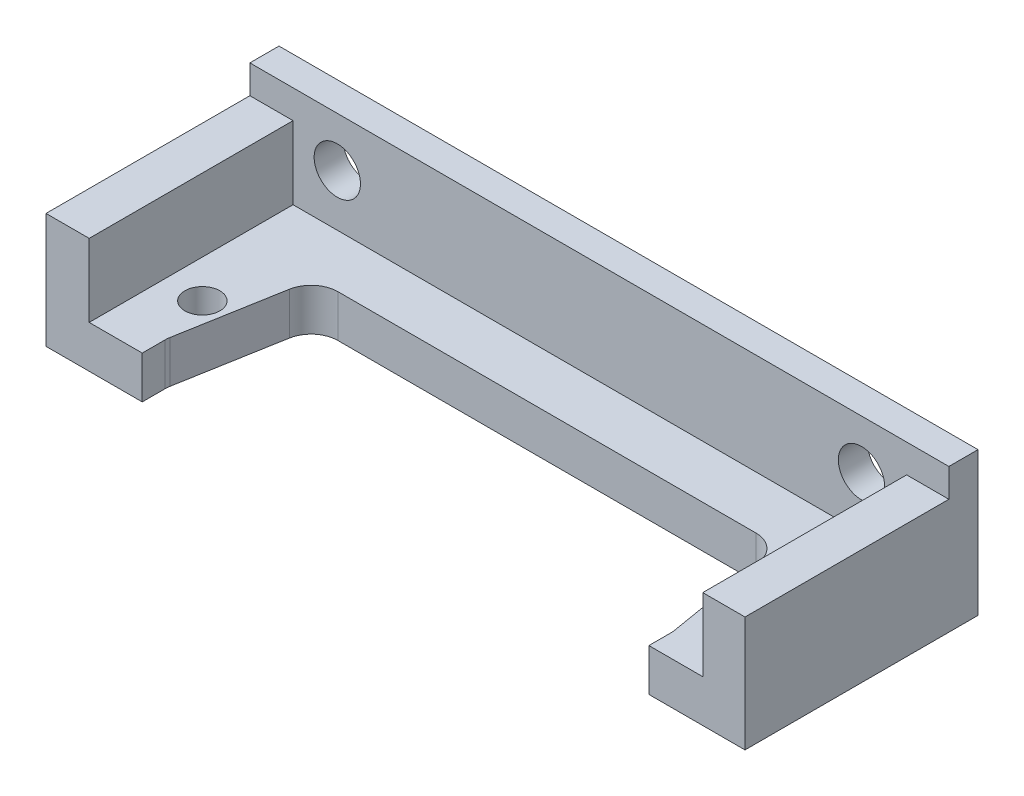
ISO-10303-21;
HEADER;
FILE_DESCRIPTION(('STEP AP214'),'2;1');
FILE_NAME('part.step','',(''),(''),'','','');
FILE_SCHEMA(('AUTOMOTIVE_DESIGN { 1 0 10303 214 1 1 1 1 }'));
ENDSEC;
DATA;
#1=APPLICATION_CONTEXT('core data for automotive mechanical design processes');
#2=APPLICATION_PROTOCOL_DEFINITION('international standard','automotive_design',2000,#1);
#3=PRODUCT_CONTEXT('',#1,'mechanical');
#4=PRODUCT('Part','Part','',(#3));
#5=PRODUCT_RELATED_PRODUCT_CATEGORY('part','',(#4));
#6=PRODUCT_DEFINITION_FORMATION('','',#4);
#7=PRODUCT_DEFINITION_CONTEXT('part definition',#1,'design');
#8=PRODUCT_DEFINITION('design','',#6,#7);
#9=PRODUCT_DEFINITION_SHAPE('','',#8);
#10=(LENGTH_UNIT() NAMED_UNIT(*) SI_UNIT(.MILLI.,.METRE.));
#11=(NAMED_UNIT(*) PLANE_ANGLE_UNIT() SI_UNIT($,.RADIAN.));
#12=(NAMED_UNIT(*) SI_UNIT($,.STERADIAN.) SOLID_ANGLE_UNIT());
#13=UNCERTAINTY_MEASURE_WITH_UNIT(LENGTH_MEASURE(1.E-05),#10,'distance_accuracy_value','');
#14=(GEOMETRIC_REPRESENTATION_CONTEXT(3) GLOBAL_UNCERTAINTY_ASSIGNED_CONTEXT((#13)) GLOBAL_UNIT_ASSIGNED_CONTEXT((#10,
#11,#12)) REPRESENTATION_CONTEXT('',''));
#15=CARTESIAN_POINT('',(0.,0.,0.));
#16=DIRECTION('',(0.,0.,1.));
#17=DIRECTION('',(1.,0.,0.));
#18=AXIS2_PLACEMENT_3D('',#15,#16,#17);
#19=CARTESIAN_POINT('',(0.,0.,20.32));
#20=DIRECTION('',(0.,0.,1.));
#21=DIRECTION('',(1.,0.,0.));
#22=AXIS2_PLACEMENT_3D('',#19,#20,#21);
#23=PLANE('',#22);
#24=DIRECTION('',(0.,1.,0.));
#25=VECTOR('',#24,1.);
#26=CARTESIAN_POINT('',(-95.7952722526986,206.215238753455,20.32));
#27=LINE('',#26,#25);
#28=CARTESIAN_POINT('',(-95.7952722526986,203.675238753455,20.32));
#29=VERTEX_POINT('',#28);
#30=CARTESIAN_POINT('',(-95.7952722526986,207.367384583948,20.32));
#31=VERTEX_POINT('',#30);
#32=EDGE_CURVE('E276',#29,#31,#27,.T.);
#33=ORIENTED_EDGE('',*,*,#32,.T.);
#34=DIRECTION('',(1.,0.,0.));
#35=VECTOR('',#34,1.);
#36=CARTESIAN_POINT('',(0.,207.367384583948,20.32));
#37=LINE('',#36,#35);
#38=CARTESIAN_POINT('',(-100.422294858781,207.367384583948,20.32));
#39=VERTEX_POINT('',#38);
#40=EDGE_CURVE('E319',#39,#31,#37,.T.);
#41=ORIENTED_EDGE('',*,*,#40,.F.);
#42=DIRECTION('',(0.,-1.,0.));
#43=VECTOR('',#42,1.);
#44=CARTESIAN_POINT('',(-100.422294858781,213.717384583948,20.32));
#45=LINE('',#44,#43);
#46=CARTESIAN_POINT('',(-100.422294858781,213.717384583948,20.32));
#47=VERTEX_POINT('',#46);
#48=EDGE_CURVE('E315',#47,#39,#45,.T.);
#49=ORIENTED_EDGE('',*,*,#48,.F.);
#50=DIRECTION('',(1.,0.,0.));
#51=VECTOR('',#50,1.);
#52=CARTESIAN_POINT('',(0.,213.717384583948,20.32));
#53=LINE('',#52,#51);
#54=CARTESIAN_POINT('',(-104.188835458781,213.717384583948,20.32));
#55=VERTEX_POINT('',#54);
#56=EDGE_CURVE('E303',#55,#47,#53,.T.);
#57=ORIENTED_EDGE('',*,*,#56,.F.);
#58=DIRECTION('',(0.,1.,0.));
#59=VECTOR('',#58,1.);
#60=CARTESIAN_POINT('',(-104.188835458781,0.,20.32));
#61=LINE('',#60,#59);
#62=CARTESIAN_POINT('',(-104.188835458781,203.675238753455,20.32));
#63=VERTEX_POINT('',#62);
#64=EDGE_CURVE('E255',#63,#55,#61,.T.);
#65=ORIENTED_EDGE('',*,*,#64,.F.);
#66=DIRECTION('',(-1.,0.,0.));
#67=VECTOR('',#66,1.);
#68=CARTESIAN_POINT('',(-95.7952722526986,203.675238753455,20.32));
#69=LINE('',#68,#67);
#70=EDGE_CURVE('E215',#29,#63,#69,.T.);
#71=ORIENTED_EDGE('',*,*,#70,.F.);
#72=EDGE_LOOP('',(#33,#41,#49,#57,#65,#71));
#73=FACE_BOUND('',#72,.T.);
#74=ADVANCED_FACE('F34',(#73),#23,.T.);
#75=CARTESIAN_POINT('',(0.,0.,2.54));
#76=DIRECTION('',(0.,0.,1.));
#77=DIRECTION('',(1.,0.,0.));
#78=AXIS2_PLACEMENT_3D('',#75,#76,#77);
#79=PLANE('',#78);
#80=DIRECTION('',(0.,-1.,0.));
#81=VECTOR('',#80,1.);
#82=CARTESIAN_POINT('',(-46.9126482587808,213.717384583948,2.54));
#83=LINE('',#82,#81);
#84=CARTESIAN_POINT('',(-46.9126482587808,213.717384583948,2.54));
#85=VERTEX_POINT('',#84);
#86=CARTESIAN_POINT('',(-46.9126482587808,207.367384583948,2.54));
#87=VERTEX_POINT('',#86);
#88=EDGE_CURVE('E295',#85,#87,#83,.T.);
#89=ORIENTED_EDGE('',*,*,#88,.F.);
#90=DIRECTION('',(-1.,0.,0.));
#91=VECTOR('',#90,1.);
#92=CARTESIAN_POINT('',(0.,213.717384583948,2.54));
#93=LINE('',#92,#91);
#94=CARTESIAN_POINT('',(-43.2288354587808,213.717384583948,2.54));
#95=VERTEX_POINT('',#94);
#96=EDGE_CURVE('E292',#95,#85,#93,.T.);
#97=ORIENTED_EDGE('',*,*,#96,.F.);
#98=DIRECTION('',(0.,-1.,0.));
#99=VECTOR('',#98,1.);
#100=CARTESIAN_POINT('',(-43.2288354587808,0.,2.54));
#101=LINE('',#100,#99);
#102=CARTESIAN_POINT('',(-43.2288354587808,216.197005798909,2.54));
#103=VERTEX_POINT('',#102);
#104=EDGE_CURVE('E239',#103,#95,#101,.T.);
#105=ORIENTED_EDGE('',*,*,#104,.F.);
#106=DIRECTION('',(-1.,0.,0.));
#107=VECTOR('',#106,1.);
#108=CARTESIAN_POINT('',(-45.7688354587808,216.197005798909,2.54));
#109=LINE('',#108,#107);
#110=CARTESIAN_POINT('',(-104.188835458781,216.197005798909,2.54));
#111=VERTEX_POINT('',#110);
#112=EDGE_CURVE('E338',#103,#111,#109,.T.);
#113=ORIENTED_EDGE('',*,*,#112,.T.);
#114=DIRECTION('',(0.,1.,0.));
#115=VECTOR('',#114,1.);
#116=CARTESIAN_POINT('',(-104.188835458781,0.,2.54));
#117=LINE('',#116,#115);
#118=CARTESIAN_POINT('',(-104.188835458781,213.717384583948,2.54));
#119=VERTEX_POINT('',#118);
#120=EDGE_CURVE('E261',#119,#111,#117,.T.);
#121=ORIENTED_EDGE('',*,*,#120,.F.);
#122=DIRECTION('',(-1.,0.,0.));
#123=VECTOR('',#122,1.);
#124=CARTESIAN_POINT('',(0.,213.717384583948,2.54));
#125=LINE('',#124,#123);
#126=CARTESIAN_POINT('',(-100.422294858781,213.717384583948,2.54));
#127=VERTEX_POINT('',#126);
#128=EDGE_CURVE('E309',#127,#119,#125,.T.);
#129=ORIENTED_EDGE('',*,*,#128,.F.);
#130=DIRECTION('',(0.,-1.,0.));
#131=VECTOR('',#130,1.);
#132=CARTESIAN_POINT('',(-100.422294858781,213.717384583948,2.54));
#133=LINE('',#132,#131);
#134=CARTESIAN_POINT('',(-100.422294858781,207.367384583948,2.54));
#135=VERTEX_POINT('',#134);
#136=EDGE_CURVE('E311',#127,#135,#133,.T.);
#137=ORIENTED_EDGE('',*,*,#136,.T.);
#138=DIRECTION('',(1.,0.,0.));
#139=VECTOR('',#138,1.);
#140=CARTESIAN_POINT('',(0.,207.367384583948,2.54));
#141=LINE('',#140,#139);
#142=EDGE_CURVE('E318',#135,#87,#141,.T.);
#143=ORIENTED_EDGE('',*,*,#142,.T.);
#144=EDGE_LOOP('',(#89,#97,#105,#113,#121,#129,#137,#143));
#145=FACE_BOUND('',#144,.T.);
#146=CARTESIAN_POINT('',(-96.5653886787808,211.879005798909,2.54));
#147=DIRECTION('',(0.,0.,1.));
#148=DIRECTION('',(1.,0.,0.));
#149=AXIS2_PLACEMENT_3D('',#146,#147,#148);
#150=CIRCLE('',#149,2.0193);
#151=CARTESIAN_POINT('',(-94.5460886787808,211.879005798909,2.54));
#152=VERTEX_POINT('',#151);
#153=EDGE_CURVE('E332',#152,#152,#150,.T.);
#154=ORIENTED_EDGE('',*,*,#153,.F.);
#155=EDGE_LOOP('',(#154));
#156=FACE_BOUND('',#155,.T.);
#157=CARTESIAN_POINT('',(-50.8488354587808,211.879005798909,2.54));
#158=DIRECTION('',(0.,0.,1.));
#159=DIRECTION('',(1.,0.,0.));
#160=AXIS2_PLACEMENT_3D('',#157,#158,#159);
#161=CIRCLE('',#160,2.01929999999998);
#162=CARTESIAN_POINT('',(-48.8295354587809,211.879005798909,2.54));
#163=VERTEX_POINT('',#162);
#164=EDGE_CURVE('E326',#163,#163,#161,.T.);
#165=ORIENTED_EDGE('',*,*,#164,.F.);
#166=EDGE_LOOP('',(#165));
#167=FACE_BOUND('',#166,.T.);
#168=ADVANCED_FACE('F396',(#145,#156,#167),#79,.T.);
#169=CARTESIAN_POINT('',(0.,207.367384583948,20.32));
#170=DIRECTION('',(0.,1.,0.));
#171=DIRECTION('',(0.,0.,1.));
#172=AXIS2_PLACEMENT_3D('',#169,#170,#171);
#173=PLANE('',#172);
#174=DIRECTION('',(0.,0.,1.));
#175=VECTOR('',#174,1.);
#176=CARTESIAN_POINT('',(-95.7952722526986,207.367384583948,0.));
#177=LINE('',#176,#175);
#178=CARTESIAN_POINT('',(-95.7952722526986,207.367384583948,18.3273435089274));
#179=VERTEX_POINT('',#178);
#180=EDGE_CURVE('E273',#179,#31,#177,.T.);
#181=ORIENTED_EDGE('',*,*,#180,.F.);
#182=CARTESIAN_POINT('',(-93.4584722526986,207.367384583948,18.3273435089274));
#183=DIRECTION('',(0.,1.,0.));
#184=DIRECTION('',(0.,0.,1.));
#185=AXIS2_PLACEMENT_3D('',#182,#183,#184);
#186=CIRCLE('',#185,2.3368);
#187=CARTESIAN_POINT('',(-95.7597710099375,207.367384583948,17.9215624473553));
#188=VERTEX_POINT('',#187);
#189=EDGE_CURVE('E353',#179,#188,#186,.F.);
#190=ORIENTED_EDGE('',*,*,#189,.T.);
#191=DIRECTION('',(-0.173648177666923,0.,0.98480775301221));
#192=VECTOR('',#191,1.);
#193=CARTESIAN_POINT('',(-89.8074929196303,207.367384583948,-15.8354840715145));
#194=LINE('',#193,#192);
#195=CARTESIAN_POINT('',(-94.2009622978847,207.367384583948,9.08111893842793));
#196=VERTEX_POINT('',#195);
#197=EDGE_CURVE('E270',#196,#188,#194,.T.);
#198=ORIENTED_EDGE('',*,*,#197,.F.);
#199=CARTESIAN_POINT('',(-91.8996635406458,207.367384583948,9.48689999999999));
#200=DIRECTION('',(0.,1.,0.));
#201=DIRECTION('',(0.,0.,1.));
#202=AXIS2_PLACEMENT_3D('',#199,#200,#201);
#203=CIRCLE('',#202,2.3368);
#204=CARTESIAN_POINT('',(-91.8996635406458,207.367384583948,7.1501));
#205=VERTEX_POINT('',#204);
#206=EDGE_CURVE('E180',#196,#205,#203,.F.);
#207=ORIENTED_EDGE('',*,*,#206,.T.);
#208=DIRECTION('',(1.,0.,0.));
#209=VECTOR('',#208,1.);
#210=CARTESIAN_POINT('',(0.,207.367384583948,7.15009999999999));
#211=LINE('',#210,#209);
#212=CARTESIAN_POINT('',(-55.4514106680026,207.367384583948,7.15009999999999));
#213=VERTEX_POINT('',#212);
#214=EDGE_CURVE('E268',#205,#213,#211,.T.);
#215=ORIENTED_EDGE('',*,*,#214,.T.);
#216=CARTESIAN_POINT('',(-55.4514106680026,207.367384583948,9.48689999999999));
#217=DIRECTION('',(0.,1.,0.));
#218=DIRECTION('',(0.,0.,1.));
#219=AXIS2_PLACEMENT_3D('',#216,#217,#218);
#220=CIRCLE('',#219,2.3368);
#221=CARTESIAN_POINT('',(-53.1469105696302,207.367384583948,9.09971330523701));
#222=VERTEX_POINT('',#221);
#223=EDGE_CURVE('E175',#213,#222,#220,.F.);
#224=ORIENTED_EDGE('',*,*,#223,.T.);
#225=DIRECTION('',(0.165690985434349,0.,0.986177720974163));
#226=VECTOR('',#225,1.);
#227=CARTESIAN_POINT('',(-53.1747417745569,207.367384583948,8.93406449715794));
#228=LINE('',#227,#226);
#229=CARTESIAN_POINT('',(-51.6439481604084,207.367384583948,18.0452092810783));
#230=VERTEX_POINT('',#229);
#231=EDGE_CURVE('E266',#222,#230,#228,.T.);
#232=ORIENTED_EDGE('',*,*,#231,.T.);
#233=CARTESIAN_POINT('',(-53.9484482587808,207.367384583948,18.4323959758413));
#234=DIRECTION('',(0.,1.,0.));
#235=DIRECTION('',(0.,0.,1.));
#236=AXIS2_PLACEMENT_3D('',#233,#234,#235);
#237=CIRCLE('',#236,2.3368);
#238=CARTESIAN_POINT('',(-51.6116482587808,207.367384583948,18.4323959758413));
#239=VERTEX_POINT('',#238);
#240=EDGE_CURVE('E11',#230,#239,#237,.F.);
#241=ORIENTED_EDGE('',*,*,#240,.T.);
#242=DIRECTION('',(0.,0.,-1.));
#243=VECTOR('',#242,1.);
#244=CARTESIAN_POINT('',(-51.6116482587808,207.367384583948,0.));
#245=LINE('',#244,#243);
#246=CARTESIAN_POINT('',(-51.6116482587808,207.367384583948,20.32));
#247=VERTEX_POINT('',#246);
#248=EDGE_CURVE('E264',#247,#239,#245,.T.);
#249=ORIENTED_EDGE('',*,*,#248,.F.);
#250=CARTESIAN_POINT('',(-46.9126482587808,207.367384583948,20.32));
#251=VERTEX_POINT('',#250);
#252=EDGE_CURVE('E323',#247,#251,#37,.T.);
#253=ORIENTED_EDGE('',*,*,#252,.T.);
#254=DIRECTION('',(0.,0.,-1.));
#255=VECTOR('',#254,1.);
#256=CARTESIAN_POINT('',(-46.9126482587808,207.367384583948,0.));
#257=LINE('',#256,#255);
#258=EDGE_CURVE('E286',#251,#87,#257,.T.);
#259=ORIENTED_EDGE('',*,*,#258,.T.);
#260=ORIENTED_EDGE('',*,*,#142,.F.);
#261=DIRECTION('',(0.,0.,-1.));
#262=VECTOR('',#261,1.);
#263=CARTESIAN_POINT('',(-100.422294858781,207.367384583948,0.));
#264=LINE('',#263,#262);
#265=EDGE_CURVE('E302',#39,#135,#264,.T.);
#266=ORIENTED_EDGE('',*,*,#265,.F.);
#267=ORIENTED_EDGE('',*,*,#40,.T.);
#268=EDGE_LOOP('',(#181,#190,#198,#207,#215,#224,#232,#241,#249,#253,#259,#260,#266,#267));
#269=FACE_BOUND('',#268,.T.);
#270=CARTESIAN_POINT('',(-50.2146482587808,207.367384583948,13.7541));
#271=DIRECTION('',(0.,1.,0.));
#272=DIRECTION('',(0.,0.,1.));
#273=AXIS2_PLACEMENT_3D('',#270,#271,#272);
#274=CIRCLE('',#273,1.524);
#275=CARTESIAN_POINT('',(-50.2146482587808,207.367384583948,15.2781));
#276=VERTEX_POINT('',#275);
#277=EDGE_CURVE('E279',#276,#276,#274,.T.);
#278=ORIENTED_EDGE('',*,*,#277,.F.);
#279=EDGE_LOOP('',(#278));
#280=FACE_BOUND('',#279,.T.);
#281=CARTESIAN_POINT('',(-97.1202948587808,207.367384583948,13.7541));
#282=DIRECTION('',(0.,1.,0.));
#283=DIRECTION('',(0.,0.,1.));
#284=AXIS2_PLACEMENT_3D('',#281,#282,#283);
#285=CIRCLE('',#284,1.52399999999999);
#286=CARTESIAN_POINT('',(-97.1202948587808,207.367384583948,15.2781));
#287=VERTEX_POINT('',#286);
#288=EDGE_CURVE('E283',#287,#287,#285,.T.);
#289=ORIENTED_EDGE('',*,*,#288,.F.);
#290=EDGE_LOOP('',(#289));
#291=FACE_BOUND('',#290,.T.);
#292=ADVANCED_FACE('F365',(#269,#280,#291),#173,.T.);
#293=CARTESIAN_POINT('',(0.,0.,0.));
#294=DIRECTION('',(0.,0.,1.));
#295=DIRECTION('',(1.,0.,0.));
#296=AXIS2_PLACEMENT_3D('',#293,#294,#295);
#297=PLANE('',#296);
#298=DIRECTION('',(0.,1.,0.));
#299=VECTOR('',#298,1.);
#300=CARTESIAN_POINT('',(-43.2288354587808,0.,0.));
#301=LINE('',#300,#299);
#302=CARTESIAN_POINT('',(-43.2288354587808,203.675238753455,0.));
#303=VERTEX_POINT('',#302);
#304=CARTESIAN_POINT('',(-43.2288354587808,216.197005798909,0.));
#305=VERTEX_POINT('',#304);
#306=EDGE_CURVE('E247',#303,#305,#301,.T.);
#307=ORIENTED_EDGE('',*,*,#306,.F.);
#308=DIRECTION('',(1.,0.,0.));
#309=VECTOR('',#308,1.);
#310=CARTESIAN_POINT('',(-104.188835458781,203.675238753455,0.));
#311=LINE('',#310,#309);
#312=CARTESIAN_POINT('',(-104.188835458781,203.675238753455,0.));
#313=VERTEX_POINT('',#312);
#314=EDGE_CURVE('E221',#313,#303,#311,.T.);
#315=ORIENTED_EDGE('',*,*,#314,.F.);
#316=DIRECTION('',(0.,-1.,0.));
#317=VECTOR('',#316,1.);
#318=CARTESIAN_POINT('',(-104.188835458781,0.,0.));
#319=LINE('',#318,#317);
#320=CARTESIAN_POINT('',(-104.188835458781,216.197005798909,0.));
#321=VERTEX_POINT('',#320);
#322=EDGE_CURVE('E253',#321,#313,#319,.T.);
#323=ORIENTED_EDGE('',*,*,#322,.F.);
#324=DIRECTION('',(-1.,0.,0.));
#325=VECTOR('',#324,1.);
#326=CARTESIAN_POINT('',(-45.7688354587808,216.197005798909,0.));
#327=LINE('',#326,#325);
#328=EDGE_CURVE('E335',#305,#321,#327,.T.);
#329=ORIENTED_EDGE('',*,*,#328,.F.);
#330=EDGE_LOOP('',(#307,#315,#323,#329));
#331=FACE_BOUND('',#330,.T.);
#332=CARTESIAN_POINT('',(-96.5653886787808,211.879005798909,0.));
#333=DIRECTION('',(0.,0.,1.));
#334=DIRECTION('',(1.,0.,0.));
#335=AXIS2_PLACEMENT_3D('',#332,#333,#334);
#336=CIRCLE('',#335,2.0193);
#337=CARTESIAN_POINT('',(-94.5460886787808,211.879005798909,0.));
#338=VERTEX_POINT('',#337);
#339=EDGE_CURVE('E329',#338,#338,#336,.T.);
#340=ORIENTED_EDGE('',*,*,#339,.T.);
#341=EDGE_LOOP('',(#340));
#342=FACE_BOUND('',#341,.T.);
#343=CARTESIAN_POINT('',(-50.8488354587808,211.879005798909,0.));
#344=DIRECTION('',(0.,0.,1.));
#345=DIRECTION('',(1.,0.,0.));
#346=AXIS2_PLACEMENT_3D('',#343,#344,#345);
#347=CIRCLE('',#346,2.01929999999998);
#348=CARTESIAN_POINT('',(-48.8295354587809,211.879005798909,0.));
#349=VERTEX_POINT('',#348);
#350=EDGE_CURVE('E322',#349,#349,#347,.T.);
#351=ORIENTED_EDGE('',*,*,#350,.T.);
#352=EDGE_LOOP('',(#351));
#353=FACE_BOUND('',#352,.T.);
#354=ADVANCED_FACE('F406',(#331,#342,#353),#297,.F.);
#355=CARTESIAN_POINT('',(-45.7688354587808,216.197005798909,2.54));
#356=DIRECTION('',(0.,-1.,0.));
#357=DIRECTION('',(0.,0.,-1.));
#358=AXIS2_PLACEMENT_3D('',#355,#356,#357);
#359=PLANE('',#358);
#360=ORIENTED_EDGE('',*,*,#328,.T.);
#361=DIRECTION('',(0.,0.,-1.));
#362=VECTOR('',#361,1.);
#363=CARTESIAN_POINT('',(-104.188835458781,216.197005798909,0.));
#364=LINE('',#363,#362);
#365=EDGE_CURVE('E250',#111,#321,#364,.T.);
#366=ORIENTED_EDGE('',*,*,#365,.F.);
#367=ORIENTED_EDGE('',*,*,#112,.F.);
#368=DIRECTION('',(0.,0.,1.));
#369=VECTOR('',#368,1.);
#370=CARTESIAN_POINT('',(-43.2288354587808,216.197005798909,0.));
#371=LINE('',#370,#369);
#372=EDGE_CURVE('E236',#305,#103,#371,.T.);
#373=ORIENTED_EDGE('',*,*,#372,.F.);
#374=EDGE_LOOP('',(#360,#366,#367,#373));
#375=FACE_BOUND('',#374,.T.);
#376=ADVANCED_FACE('F401',(#375),#359,.F.);
#377=CARTESIAN_POINT('',(-96.5653886787808,211.879005798909,2.54));
#378=DIRECTION('',(0.,0.,-1.));
#379=DIRECTION('',(-1.,0.,0.));
#380=AXIS2_PLACEMENT_3D('',#377,#378,#379);
#381=CYLINDRICAL_SURFACE('',#380,2.0193);
#382=ORIENTED_EDGE('',*,*,#153,.T.);
#383=EDGE_LOOP('',(#382));
#384=FACE_BOUND('',#383,.T.);
#385=ORIENTED_EDGE('',*,*,#339,.F.);
#386=EDGE_LOOP('',(#385));
#387=FACE_BOUND('',#386,.T.);
#388=ADVANCED_FACE('F448',(#384,#387),#381,.F.);
#389=CARTESIAN_POINT('',(-50.8488354587808,211.879005798909,2.54));
#390=DIRECTION('',(0.,0.,-1.));
#391=DIRECTION('',(-1.,0.,0.));
#392=AXIS2_PLACEMENT_3D('',#389,#390,#391);
#393=CYLINDRICAL_SURFACE('',#392,2.01929999999998);
#394=ORIENTED_EDGE('',*,*,#164,.T.);
#395=EDGE_LOOP('',(#394));
#396=FACE_BOUND('',#395,.T.);
#397=ORIENTED_EDGE('',*,*,#350,.F.);
#398=EDGE_LOOP('',(#397));
#399=FACE_BOUND('',#398,.T.);
#400=ADVANCED_FACE('F443',(#396,#399),#393,.F.);
#401=DIRECTION('',(0.,1.,0.));
#402=VECTOR('',#401,1.);
#403=CARTESIAN_POINT('',(-51.6116482587808,206.215238753455,20.32));
#404=LINE('',#403,#402);
#405=CARTESIAN_POINT('',(-51.6116482587808,203.675238753455,20.32));
#406=VERTEX_POINT('',#405);
#407=EDGE_CURVE('E275',#406,#247,#404,.T.);
#408=ORIENTED_EDGE('',*,*,#407,.F.);
#409=DIRECTION('',(-1.,0.,0.));
#410=VECTOR('',#409,1.);
#411=CARTESIAN_POINT('',(-43.2288354587808,203.675238753455,20.32));
#412=LINE('',#411,#410);
#413=CARTESIAN_POINT('',(-43.2288354587808,203.675238753455,20.32));
#414=VERTEX_POINT('',#413);
#415=EDGE_CURVE('E227',#414,#406,#412,.T.);
#416=ORIENTED_EDGE('',*,*,#415,.F.);
#417=DIRECTION('',(0.,-1.,0.));
#418=VECTOR('',#417,1.);
#419=CARTESIAN_POINT('',(-43.2288354587808,0.,20.32));
#420=LINE('',#419,#418);
#421=CARTESIAN_POINT('',(-43.2288354587808,213.717384583948,20.32));
#422=VERTEX_POINT('',#421);
#423=EDGE_CURVE('E245',#422,#414,#420,.T.);
#424=ORIENTED_EDGE('',*,*,#423,.F.);
#425=DIRECTION('',(1.,0.,0.));
#426=VECTOR('',#425,1.);
#427=CARTESIAN_POINT('',(0.,213.717384583948,20.32));
#428=LINE('',#427,#426);
#429=CARTESIAN_POINT('',(-46.9126482587808,213.717384583948,20.32));
#430=VERTEX_POINT('',#429);
#431=EDGE_CURVE('E290',#430,#422,#428,.T.);
#432=ORIENTED_EDGE('',*,*,#431,.F.);
#433=DIRECTION('',(0.,-1.,0.));
#434=VECTOR('',#433,1.);
#435=CARTESIAN_POINT('',(-46.9126482587808,213.717384583948,20.32));
#436=LINE('',#435,#434);
#437=EDGE_CURVE('E299',#430,#251,#436,.T.);
#438=ORIENTED_EDGE('',*,*,#437,.T.);
#439=ORIENTED_EDGE('',*,*,#252,.F.);
#440=EDGE_LOOP('',(#408,#416,#424,#432,#438,#439));
#441=FACE_BOUND('',#440,.T.);
#442=ADVANCED_FACE('F415',(#441),#23,.T.);
#443=CARTESIAN_POINT('',(-100.422294858781,213.717384583948,0.));
#444=DIRECTION('',(-1.,0.,0.));
#445=DIRECTION('',(0.,0.,1.));
#446=AXIS2_PLACEMENT_3D('',#443,#444,#445);
#447=PLANE('',#446);
#448=ORIENTED_EDGE('',*,*,#265,.T.);
#449=ORIENTED_EDGE('',*,*,#136,.F.);
#450=DIRECTION('',(0.,0.,-1.));
#451=VECTOR('',#450,1.);
#452=CARTESIAN_POINT('',(-100.422294858781,213.717384583948,0.));
#453=LINE('',#452,#451);
#454=EDGE_CURVE('E306',#47,#127,#453,.T.);
#455=ORIENTED_EDGE('',*,*,#454,.F.);
#456=ORIENTED_EDGE('',*,*,#48,.T.);
#457=EDGE_LOOP('',(#448,#449,#455,#456));
#458=FACE_BOUND('',#457,.T.);
#459=ADVANCED_FACE('F387',(#458),#447,.F.);
#460=CARTESIAN_POINT('',(0.,213.717384583948,0.));
#461=DIRECTION('',(0.,1.,0.));
#462=DIRECTION('',(0.,0.,1.));
#463=AXIS2_PLACEMENT_3D('',#460,#461,#462);
#464=PLANE('',#463);
#465=ORIENTED_EDGE('',*,*,#56,.T.);
#466=ORIENTED_EDGE('',*,*,#454,.T.);
#467=ORIENTED_EDGE('',*,*,#128,.T.);
#468=DIRECTION('',(0.,0.,-1.));
#469=VECTOR('',#468,1.);
#470=CARTESIAN_POINT('',(-104.188835458781,213.717384583948,0.));
#471=LINE('',#470,#469);
#472=EDGE_CURVE('E258',#55,#119,#471,.T.);
#473=ORIENTED_EDGE('',*,*,#472,.F.);
#474=EDGE_LOOP('',(#465,#466,#467,#473));
#475=FACE_BOUND('',#474,.T.);
#476=ADVANCED_FACE('F394',(#475),#464,.T.);
#477=CARTESIAN_POINT('',(-46.9126482587808,213.717384583948,0.));
#478=DIRECTION('',(-1.,0.,0.));
#479=DIRECTION('',(0.,0.,1.));
#480=AXIS2_PLACEMENT_3D('',#477,#478,#479);
#481=PLANE('',#480);
#482=ORIENTED_EDGE('',*,*,#258,.F.);
#483=ORIENTED_EDGE('',*,*,#437,.F.);
#484=DIRECTION('',(0.,0.,-1.));
#485=VECTOR('',#484,1.);
#486=CARTESIAN_POINT('',(-46.9126482587808,213.717384583948,0.));
#487=LINE('',#486,#485);
#488=EDGE_CURVE('E287',#430,#85,#487,.T.);
#489=ORIENTED_EDGE('',*,*,#488,.T.);
#490=ORIENTED_EDGE('',*,*,#88,.T.);
#491=EDGE_LOOP('',(#482,#483,#489,#490));
#492=FACE_BOUND('',#491,.T.);
#493=ADVANCED_FACE('F420',(#492),#481,.T.);
#494=CARTESIAN_POINT('',(0.,213.717384583948,0.));
#495=DIRECTION('',(0.,1.,0.));
#496=DIRECTION('',(0.,0.,1.));
#497=AXIS2_PLACEMENT_3D('',#494,#495,#496);
#498=PLANE('',#497);
#499=ORIENTED_EDGE('',*,*,#488,.F.);
#500=ORIENTED_EDGE('',*,*,#431,.T.);
#501=DIRECTION('',(0.,0.,1.));
#502=VECTOR('',#501,1.);
#503=CARTESIAN_POINT('',(-43.2288354587808,213.717384583948,0.));
#504=LINE('',#503,#502);
#505=EDGE_CURVE('E242',#95,#422,#504,.T.);
#506=ORIENTED_EDGE('',*,*,#505,.F.);
#507=ORIENTED_EDGE('',*,*,#96,.T.);
#508=EDGE_LOOP('',(#499,#500,#506,#507));
#509=FACE_BOUND('',#508,.T.);
#510=ADVANCED_FACE('F422',(#509),#498,.T.);
#511=CARTESIAN_POINT('',(-97.1202948587808,206.215238753455,13.7541));
#512=DIRECTION('',(0.,1.,0.));
#513=DIRECTION('',(0.,0.,1.));
#514=AXIS2_PLACEMENT_3D('',#511,#512,#513);
#515=CYLINDRICAL_SURFACE('',#514,1.52399999999999);
#516=CARTESIAN_POINT('',(-97.1202948587808,203.675238753455,13.7541));
#517=DIRECTION('',(0.,-1.,0.));
#518=DIRECTION('',(0.,0.,-1.));
#519=AXIS2_PLACEMENT_3D('',#516,#517,#518);
#520=CIRCLE('',#519,1.52399999999999);
#521=CARTESIAN_POINT('',(-97.1202948587808,203.675238753455,15.2781));
#522=VERTEX_POINT('',#521);
#523=EDGE_CURVE('E201',#522,#522,#520,.T.);
#524=CARTESIAN_POINT('',(-97.1202948587808,207.367384583948,15.2781));
#525=CARTESIAN_POINT('',(-97.1202948587808,207.328924731547,15.2781));
#526=CARTESIAN_POINT('',(-97.1202948587808,207.290464879146,15.2781));
#527=CARTESIAN_POINT('',(-97.1202948587808,207.213545174345,15.2781));
#528=CARTESIAN_POINT('',(-97.1202948587808,207.175085321944,15.2781));
#529=CARTESIAN_POINT('',(-97.1202948587808,207.098165617142,15.2781));
#530=CARTESIAN_POINT('',(-97.1202948587808,207.059705764741,15.2781));
#531=CARTESIAN_POINT('',(-97.1202948587808,206.982786059939,15.2781));
#532=CARTESIAN_POINT('',(-97.1202948587808,206.944326207538,15.2781));
#533=CARTESIAN_POINT('',(-97.1202948587808,206.867406502736,15.2781));
#534=CARTESIAN_POINT('',(-97.1202948587808,206.828946650335,15.2781));
#535=CARTESIAN_POINT('',(-97.1202948587808,206.752026945533,15.2781));
#536=CARTESIAN_POINT('',(-97.1202948587808,206.713567093132,15.2781));
#537=CARTESIAN_POINT('',(-97.1202948587808,206.63664738833,15.2781));
#538=CARTESIAN_POINT('',(-97.1202948587808,206.598187535929,15.2781));
#539=CARTESIAN_POINT('',(-97.1202948587808,206.521267831127,15.2781));
#540=CARTESIAN_POINT('',(-97.1202948587808,206.482807978726,15.2781));
#541=CARTESIAN_POINT('',(-97.1202948587808,206.405888273924,15.2781));
#542=CARTESIAN_POINT('',(-97.1202948587808,206.367428421523,15.2781));
#543=CARTESIAN_POINT('',(-97.1202948587808,206.290508716721,15.2781));
#544=CARTESIAN_POINT('',(-97.1202948587808,206.25204886432,15.2781));
#545=CARTESIAN_POINT('',(-97.1202948587808,206.175129159518,15.2781));
#546=CARTESIAN_POINT('',(-97.1202948587808,206.136669307117,15.2781));
#547=CARTESIAN_POINT('',(-97.1202948587808,206.059749602315,15.2781));
#548=CARTESIAN_POINT('',(-97.1202948587808,206.021289749914,15.2781));
#549=CARTESIAN_POINT('',(-97.1202948587808,205.944370045112,15.2781));
#550=CARTESIAN_POINT('',(-97.1202948587808,205.905910192711,15.2781));
#551=CARTESIAN_POINT('',(-97.1202948587808,205.828990487909,15.2781));
#552=CARTESIAN_POINT('',(-97.1202948587808,205.790530635508,15.2781));
#553=CARTESIAN_POINT('',(-97.1202948587808,205.713610930707,15.2781));
#554=CARTESIAN_POINT('',(-97.1202948587808,205.675151078306,15.2781));
#555=CARTESIAN_POINT('',(-97.1202948587808,205.598231373504,15.2781));
#556=CARTESIAN_POINT('',(-97.1202948587808,205.559771521103,15.2781));
#557=CARTESIAN_POINT('',(-97.1202948587808,205.482851816301,15.2781));
#558=CARTESIAN_POINT('',(-97.1202948587808,205.4443919639,15.2781));
#559=CARTESIAN_POINT('',(-97.1202948587808,205.367472259098,15.2781));
#560=CARTESIAN_POINT('',(-97.1202948587808,205.329012406697,15.2781));
#561=CARTESIAN_POINT('',(-97.1202948587808,205.252092701895,15.2781));
#562=CARTESIAN_POINT('',(-97.1202948587808,205.213632849494,15.2781));
#563=CARTESIAN_POINT('',(-97.1202948587808,205.136713144692,15.2781));
#564=CARTESIAN_POINT('',(-97.1202948587808,205.098253292291,15.2781));
#565=CARTESIAN_POINT('',(-97.1202948587808,205.021333587489,15.2781));
#566=CARTESIAN_POINT('',(-97.1202948587808,204.982873735088,15.2781));
#567=CARTESIAN_POINT('',(-97.1202948587808,204.905954030286,15.2781));
#568=CARTESIAN_POINT('',(-97.1202948587808,204.867494177885,15.2781));
#569=CARTESIAN_POINT('',(-97.1202948587808,204.790574473083,15.2781));
#570=CARTESIAN_POINT('',(-97.1202948587808,204.752114620682,15.2781));
#571=CARTESIAN_POINT('',(-97.1202948587808,204.67519491588,15.2781));
#572=CARTESIAN_POINT('',(-97.1202948587808,204.636735063479,15.2781));
#573=CARTESIAN_POINT('',(-97.1202948587808,204.559815358677,15.2781));
#574=CARTESIAN_POINT('',(-97.1202948587808,204.521355506276,15.2781));
#575=CARTESIAN_POINT('',(-97.1202948587808,204.444435801474,15.2781));
#576=CARTESIAN_POINT('',(-97.1202948587808,204.405975949073,15.2781));
#577=CARTESIAN_POINT('',(-97.1202948587808,204.329056244271,15.2781));
#578=CARTESIAN_POINT('',(-97.1202948587808,204.290596391871,15.2781));
#579=CARTESIAN_POINT('',(-97.1202948587808,204.213676687069,15.2781));
#580=CARTESIAN_POINT('',(-97.1202948587808,204.175216834668,15.2781));
#581=CARTESIAN_POINT('',(-97.1202948587808,204.098297129866,15.2781));
#582=CARTESIAN_POINT('',(-97.1202948587808,204.059837277465,15.2781));
#583=CARTESIAN_POINT('',(-97.1202948587808,203.982917572663,15.2781));
#584=CARTESIAN_POINT('',(-97.1202948587808,203.944457720262,15.2781));
#585=CARTESIAN_POINT('',(-97.1202948587808,203.86753801546,15.2781));
#586=CARTESIAN_POINT('',(-97.1202948587808,203.829078163059,15.2781));
#587=CARTESIAN_POINT('',(-97.1202948587808,203.752158458257,15.2781));
#588=CARTESIAN_POINT('',(-97.1202948587808,203.713698605856,15.2781));
#589=CARTESIAN_POINT('',(-97.1202948587808,203.675238753455,15.2781));
#590=B_SPLINE_CURVE_WITH_KNOTS('',3,(#524,#525,#526,#527,#528,#529,#530,#531,#532,#533,#534,
#535,#536,#537,#538,#539,#540,#541,#542,#543,#544,#545,#546,#547,#548,#549,#550,#551,#552,#553,
#554,#555,#556,#557,#558,#559,#560,#561,#562,#563,#564,#565,#566,#567,#568,#569,#570,#571,#572,
#573,#574,#575,#576,#577,#578,#579,#580,#581,#582,#583,#584,#585,#586,#587,#588,#589),
.UNSPECIFIED.,.F.,.F.,(4,2,2,2,2,2,2,2,2,2,2,2,2,2,2,2,2,2,2,2,2,2,2,2,2,2,2,2,2,2,2,2,4),(0.,
0.115379557202921,0.230759114405843,0.346138671608764,0.461518228811686,0.576897786014607,
0.692277343217529,0.80765690042045,0.923036457623372,1.03841601482629,1.15379557202921,
1.26917512923214,1.38455468643506,1.49993424363798,1.6153138008409,1.73069335804382,
1.84607291524674,1.96145247244967,2.07683202965259,2.19221158685551,2.30759114405843,
2.42297070126135,2.53835025846427,2.65372981566719,2.76910937287012,2.88448893007304,
2.99986848727596,3.11524804447888,3.2306276016818,3.34600715888472,3.46138671608764,
3.57676627329057,3.69214583049349),.UNSPECIFIED.);
#591=EDGE_CURVE('BSEAM424',#287,#522,#590,.T.);
#592=ORIENTED_EDGE('',*,*,#288,.T.);
#593=ORIENTED_EDGE('',*,*,#523,.T.);
#594=ORIENTED_EDGE('',*,*,#591,.T.);
#595=ORIENTED_EDGE('',*,*,#591,.F.);
#596=EDGE_LOOP('',(#592,#594,#593,#595));
#597=FACE_BOUND('',#596,.T.);
#598=ADVANCED_FACE('F424',(#597),#515,.F.);
#599=CARTESIAN_POINT('',(-50.2146482587808,206.215238753455,13.7541));
#600=DIRECTION('',(0.,1.,0.));
#601=DIRECTION('',(0.,0.,1.));
#602=AXIS2_PLACEMENT_3D('',#599,#600,#601);
#603=CYLINDRICAL_SURFACE('',#602,1.524);
#604=CARTESIAN_POINT('',(-50.2146482587808,203.675238753455,13.7541));
#605=DIRECTION('',(0.,-1.,0.));
#606=DIRECTION('',(0.,0.,-1.));
#607=AXIS2_PLACEMENT_3D('',#604,#605,#606);
#608=CIRCLE('',#607,1.524);
#609=CARTESIAN_POINT('',(-50.2146482587808,203.675238753455,15.2781));
#610=VERTEX_POINT('',#609);
#611=EDGE_CURVE('E198',#610,#610,#608,.T.);
#612=CARTESIAN_POINT('',(-50.2146482587808,207.367384583948,15.2781));
#613=CARTESIAN_POINT('',(-50.2146482587808,207.328924731547,15.2781));
#614=CARTESIAN_POINT('',(-50.2146482587808,207.290464879146,15.2781));
#615=CARTESIAN_POINT('',(-50.2146482587808,207.213545174345,15.2781));
#616=CARTESIAN_POINT('',(-50.2146482587808,207.175085321944,15.2781));
#617=CARTESIAN_POINT('',(-50.2146482587808,207.098165617142,15.2781));
#618=CARTESIAN_POINT('',(-50.2146482587808,207.059705764741,15.2781));
#619=CARTESIAN_POINT('',(-50.2146482587808,206.982786059939,15.2781));
#620=CARTESIAN_POINT('',(-50.2146482587808,206.944326207538,15.2781));
#621=CARTESIAN_POINT('',(-50.2146482587808,206.867406502736,15.2781));
#622=CARTESIAN_POINT('',(-50.2146482587808,206.828946650335,15.2781));
#623=CARTESIAN_POINT('',(-50.2146482587808,206.752026945533,15.2781));
#624=CARTESIAN_POINT('',(-50.2146482587808,206.713567093132,15.2781));
#625=CARTESIAN_POINT('',(-50.2146482587808,206.63664738833,15.2781));
#626=CARTESIAN_POINT('',(-50.2146482587808,206.598187535929,15.2781));
#627=CARTESIAN_POINT('',(-50.2146482587808,206.521267831127,15.2781));
#628=CARTESIAN_POINT('',(-50.2146482587808,206.482807978726,15.2781));
#629=CARTESIAN_POINT('',(-50.2146482587808,206.405888273924,15.2781));
#630=CARTESIAN_POINT('',(-50.2146482587808,206.367428421523,15.2781));
#631=CARTESIAN_POINT('',(-50.2146482587808,206.290508716721,15.2781));
#632=CARTESIAN_POINT('',(-50.2146482587808,206.25204886432,15.2781));
#633=CARTESIAN_POINT('',(-50.2146482587808,206.175129159518,15.2781));
#634=CARTESIAN_POINT('',(-50.2146482587808,206.136669307117,15.2781));
#635=CARTESIAN_POINT('',(-50.2146482587808,206.059749602315,15.2781));
#636=CARTESIAN_POINT('',(-50.2146482587808,206.021289749914,15.2781));
#637=CARTESIAN_POINT('',(-50.2146482587808,205.944370045112,15.2781));
#638=CARTESIAN_POINT('',(-50.2146482587808,205.905910192711,15.2781));
#639=CARTESIAN_POINT('',(-50.2146482587808,205.828990487909,15.2781));
#640=CARTESIAN_POINT('',(-50.2146482587808,205.790530635508,15.2781));
#641=CARTESIAN_POINT('',(-50.2146482587808,205.713610930707,15.2781));
#642=CARTESIAN_POINT('',(-50.2146482587808,205.675151078306,15.2781));
#643=CARTESIAN_POINT('',(-50.2146482587808,205.598231373504,15.2781));
#644=CARTESIAN_POINT('',(-50.2146482587808,205.559771521103,15.2781));
#645=CARTESIAN_POINT('',(-50.2146482587808,205.482851816301,15.2781));
#646=CARTESIAN_POINT('',(-50.2146482587808,205.4443919639,15.2781));
#647=CARTESIAN_POINT('',(-50.2146482587808,205.367472259098,15.2781));
#648=CARTESIAN_POINT('',(-50.2146482587808,205.329012406697,15.2781));
#649=CARTESIAN_POINT('',(-50.2146482587808,205.252092701895,15.2781));
#650=CARTESIAN_POINT('',(-50.2146482587808,205.213632849494,15.2781));
#651=CARTESIAN_POINT('',(-50.2146482587808,205.136713144692,15.2781));
#652=CARTESIAN_POINT('',(-50.2146482587808,205.098253292291,15.2781));
#653=CARTESIAN_POINT('',(-50.2146482587808,205.021333587489,15.2781));
#654=CARTESIAN_POINT('',(-50.2146482587808,204.982873735088,15.2781));
#655=CARTESIAN_POINT('',(-50.2146482587808,204.905954030286,15.2781));
#656=CARTESIAN_POINT('',(-50.2146482587808,204.867494177885,15.2781));
#657=CARTESIAN_POINT('',(-50.2146482587808,204.790574473083,15.2781));
#658=CARTESIAN_POINT('',(-50.2146482587808,204.752114620682,15.2781));
#659=CARTESIAN_POINT('',(-50.2146482587808,204.67519491588,15.2781));
#660=CARTESIAN_POINT('',(-50.2146482587808,204.636735063479,15.2781));
#661=CARTESIAN_POINT('',(-50.2146482587808,204.559815358677,15.2781));
#662=CARTESIAN_POINT('',(-50.2146482587808,204.521355506276,15.2781));
#663=CARTESIAN_POINT('',(-50.2146482587808,204.444435801474,15.2781));
#664=CARTESIAN_POINT('',(-50.2146482587808,204.405975949073,15.2781));
#665=CARTESIAN_POINT('',(-50.2146482587808,204.329056244271,15.2781));
#666=CARTESIAN_POINT('',(-50.2146482587808,204.290596391871,15.2781));
#667=CARTESIAN_POINT('',(-50.2146482587808,204.213676687069,15.2781));
#668=CARTESIAN_POINT('',(-50.2146482587808,204.175216834668,15.2781));
#669=CARTESIAN_POINT('',(-50.2146482587808,204.098297129866,15.2781));
#670=CARTESIAN_POINT('',(-50.2146482587808,204.059837277465,15.2781));
#671=CARTESIAN_POINT('',(-50.2146482587808,203.982917572663,15.2781));
#672=CARTESIAN_POINT('',(-50.2146482587808,203.944457720262,15.2781));
#673=CARTESIAN_POINT('',(-50.2146482587808,203.86753801546,15.2781));
#674=CARTESIAN_POINT('',(-50.2146482587808,203.829078163059,15.2781));
#675=CARTESIAN_POINT('',(-50.2146482587808,203.752158458257,15.2781));
#676=CARTESIAN_POINT('',(-50.2146482587808,203.713698605856,15.2781));
#677=CARTESIAN_POINT('',(-50.2146482587808,203.675238753455,15.2781));
#678=B_SPLINE_CURVE_WITH_KNOTS('',3,(#612,#613,#614,#615,#616,#617,#618,#619,#620,#621,#622,
#623,#624,#625,#626,#627,#628,#629,#630,#631,#632,#633,#634,#635,#636,#637,#638,#639,#640,#641,
#642,#643,#644,#645,#646,#647,#648,#649,#650,#651,#652,#653,#654,#655,#656,#657,#658,#659,#660,
#661,#662,#663,#664,#665,#666,#667,#668,#669,#670,#671,#672,#673,#674,#675,#676,#677),
.UNSPECIFIED.,.F.,.F.,(4,2,2,2,2,2,2,2,2,2,2,2,2,2,2,2,2,2,2,2,2,2,2,2,2,2,2,2,2,2,2,2,4),(0.,
0.115379557202921,0.230759114405843,0.346138671608764,0.461518228811686,0.576897786014607,
0.692277343217529,0.80765690042045,0.923036457623372,1.03841601482629,1.15379557202921,
1.26917512923214,1.38455468643506,1.49993424363798,1.6153138008409,1.73069335804382,
1.84607291524674,1.96145247244967,2.07683202965259,2.19221158685551,2.30759114405843,
2.42297070126135,2.53835025846427,2.65372981566719,2.76910937287012,2.88448893007304,
2.99986848727596,3.11524804447888,3.2306276016818,3.34600715888472,3.46138671608764,
3.57676627329057,3.69214583049349),.UNSPECIFIED.);
#679=EDGE_CURVE('BSEAM430',#276,#610,#678,.T.);
#680=ORIENTED_EDGE('',*,*,#277,.T.);
#681=ORIENTED_EDGE('',*,*,#611,.T.);
#682=ORIENTED_EDGE('',*,*,#679,.T.);
#683=ORIENTED_EDGE('',*,*,#679,.F.);
#684=EDGE_LOOP('',(#680,#682,#681,#683));
#685=FACE_BOUND('',#684,.T.);
#686=ADVANCED_FACE('F430',(#685),#603,.F.);
#687=CARTESIAN_POINT('',(-95.7952722526986,206.215238753455,0.));
#688=DIRECTION('',(-1.,0.,0.));
#689=DIRECTION('',(0.,0.,1.));
#690=AXIS2_PLACEMENT_3D('',#687,#688,#689);
#691=PLANE('',#690);
#692=ORIENTED_EDGE('',*,*,#32,.F.);
#693=DIRECTION('',(0.,0.,1.));
#694=VECTOR('',#693,1.);
#695=CARTESIAN_POINT('',(-95.7952722526986,203.675238753455,18.3273435089274));
#696=LINE('',#695,#694);
#697=CARTESIAN_POINT('',(-95.7952722526986,203.675238753455,18.3273435089274));
#698=VERTEX_POINT('',#697);
#699=EDGE_CURVE('E212',#698,#29,#696,.T.);
#700=ORIENTED_EDGE('',*,*,#699,.F.);
#701=DIRECTION('',(0.,1.,0.));
#702=VECTOR('',#701,1.);
#703=CARTESIAN_POINT('',(-95.7952722526986,207.367384583948,18.3273435089274));
#704=LINE('',#703,#702);
#705=EDGE_CURVE('E348',#698,#179,#704,.T.);
#706=ORIENTED_EDGE('',*,*,#705,.T.);
#707=ORIENTED_EDGE('',*,*,#180,.T.);
#708=EDGE_LOOP('',(#692,#700,#706,#707));
#709=FACE_BOUND('',#708,.T.);
#710=ADVANCED_FACE('F380',(#709),#691,.F.);
#711=CARTESIAN_POINT('',(-89.8074929196303,206.215238753455,-15.8354840715145));
#712=DIRECTION('',(-0.984807753012209,0.,-0.173648177666923));
#713=DIRECTION('',(-0.173648177666923,0.,0.984807753012209));
#714=AXIS2_PLACEMENT_3D('',#711,#712,#713);
#715=PLANE('',#714);
#716=ORIENTED_EDGE('',*,*,#197,.T.);
#717=DIRECTION('',(0.,1.,0.));
#718=VECTOR('',#717,1.);
#719=CARTESIAN_POINT('',(-95.7597710099375,206.215238753455,17.9215624473553));
#720=LINE('',#719,#718);
#721=CARTESIAN_POINT('',(-95.7597710099375,203.675238753455,17.9215624473553));
#722=VERTEX_POINT('',#721);
#723=EDGE_CURVE('E351',#188,#722,#720,.F.);
#724=ORIENTED_EDGE('',*,*,#723,.T.);
#725=DIRECTION('',(-0.173648177666922,0.,0.984807753012209));
#726=VECTOR('',#725,1.);
#727=CARTESIAN_POINT('',(-94.2009622978847,203.675238753455,9.08111893842794));
#728=LINE('',#727,#726);
#729=CARTESIAN_POINT('',(-94.2009622978847,203.675238753455,9.08111893842794));
#730=VERTEX_POINT('',#729);
#731=EDGE_CURVE('E206',#730,#722,#728,.T.);
#732=ORIENTED_EDGE('',*,*,#731,.F.);
#733=DIRECTION('',(0.,1.,0.));
#734=VECTOR('',#733,1.);
#735=CARTESIAN_POINT('',(-94.2009622978847,206.215238753455,9.08111893842793));
#736=LINE('',#735,#734);
#737=EDGE_CURVE('E340',#730,#196,#736,.T.);
#738=ORIENTED_EDGE('',*,*,#737,.T.);
#739=EDGE_LOOP('',(#716,#724,#732,#738));
#740=FACE_BOUND('',#739,.T.);
#741=ADVANCED_FACE('F373',(#740),#715,.F.);
#742=CARTESIAN_POINT('',(0.,206.215238753455,7.15009999999999));
#743=DIRECTION('',(0.,0.,1.));
#744=DIRECTION('',(1.,0.,0.));
#745=AXIS2_PLACEMENT_3D('',#742,#743,#744);
#746=PLANE('',#745);
#747=DIRECTION('',(0.,1.,0.));
#748=VECTOR('',#747,1.);
#749=CARTESIAN_POINT('',(-91.8996635406458,206.215238753455,7.1501));
#750=LINE('',#749,#748);
#751=CARTESIAN_POINT('',(-91.8996635406458,203.675238753455,7.1501));
#752=VERTEX_POINT('',#751);
#753=EDGE_CURVE('E186',#205,#752,#750,.F.);
#754=ORIENTED_EDGE('',*,*,#753,.T.);
#755=DIRECTION('',(-1.,0.,0.));
#756=VECTOR('',#755,1.);
#757=CARTESIAN_POINT('',(-55.4514106680026,203.675238753455,7.15009999999999));
#758=LINE('',#757,#756);
#759=CARTESIAN_POINT('',(-55.4514106680026,203.675238753455,7.15009999999999));
#760=VERTEX_POINT('',#759);
#761=EDGE_CURVE('E183',#760,#752,#758,.T.);
#762=ORIENTED_EDGE('',*,*,#761,.F.);
#763=DIRECTION('',(0.,1.,0.));
#764=VECTOR('',#763,1.);
#765=CARTESIAN_POINT('',(-55.4514106680026,207.367384583948,7.15009999999999));
#766=LINE('',#765,#764);
#767=EDGE_CURVE('E169',#760,#213,#766,.T.);
#768=ORIENTED_EDGE('',*,*,#767,.T.);
#769=ORIENTED_EDGE('',*,*,#214,.F.);
#770=EDGE_LOOP('',(#754,#762,#768,#769));
#771=FACE_BOUND('',#770,.T.);
#772=ADVANCED_FACE('F184',(#771),#746,.T.);
#773=CARTESIAN_POINT('',(-53.1747417745569,206.215238753455,8.93406449715794));
#774=DIRECTION('',(-0.986177720974163,0.,0.165690985434349));
#775=DIRECTION('',(0.165690985434349,0.,0.986177720974163));
#776=AXIS2_PLACEMENT_3D('',#773,#774,#775);
#777=PLANE('',#776);
#778=DIRECTION('',(0.,1.,0.));
#779=VECTOR('',#778,1.);
#780=CARTESIAN_POINT('',(-53.1469105696302,206.215238753455,9.09971330523701));
#781=LINE('',#780,#779);
#782=CARTESIAN_POINT('',(-53.1469105696302,203.675238753455,9.09971330523701));
#783=VERTEX_POINT('',#782);
#784=EDGE_CURVE('E179',#222,#783,#781,.F.);
#785=ORIENTED_EDGE('',*,*,#784,.T.);
#786=DIRECTION('',(-0.165690985434349,0.,-0.986177720974163));
#787=VECTOR('',#786,1.);
#788=CARTESIAN_POINT('',(-51.6439481604084,203.675238753455,18.0452092810783));
#789=LINE('',#788,#787);
#790=CARTESIAN_POINT('',(-51.6439481604084,203.675238753455,18.0452092810783));
#791=VERTEX_POINT('',#790);
#792=EDGE_CURVE('E197',#791,#783,#789,.T.);
#793=ORIENTED_EDGE('',*,*,#792,.F.);
#794=DIRECTION('',(0.,1.,0.));
#795=VECTOR('',#794,1.);
#796=CARTESIAN_POINT('',(-51.6439481604084,206.215238753455,18.0452092810783));
#797=LINE('',#796,#795);
#798=EDGE_CURVE('E355',#791,#230,#797,.T.);
#799=ORIENTED_EDGE('',*,*,#798,.T.);
#800=ORIENTED_EDGE('',*,*,#231,.F.);
#801=EDGE_LOOP('',(#785,#793,#799,#800));
#802=FACE_BOUND('',#801,.T.);
#803=ADVANCED_FACE('F363',(#802),#777,.T.);
#804=CARTESIAN_POINT('',(-51.6116482587808,206.215238753455,0.));
#805=DIRECTION('',(1.,0.,0.));
#806=DIRECTION('',(0.,0.,-1.));
#807=AXIS2_PLACEMENT_3D('',#804,#805,#806);
#808=PLANE('',#807);
#809=ORIENTED_EDGE('',*,*,#248,.T.);
#810=DIRECTION('',(0.,1.,0.));
#811=VECTOR('',#810,1.);
#812=CARTESIAN_POINT('',(-51.6116482587808,206.215238753455,18.4323959758413));
#813=LINE('',#812,#811);
#814=CARTESIAN_POINT('',(-51.6116482587808,203.675238753455,18.4323959758413));
#815=VERTEX_POINT('',#814);
#816=EDGE_CURVE('E42',#239,#815,#813,.F.);
#817=ORIENTED_EDGE('',*,*,#816,.T.);
#818=DIRECTION('',(0.,0.,-1.));
#819=VECTOR('',#818,1.);
#820=CARTESIAN_POINT('',(-51.6116482587808,203.675238753455,20.32));
#821=LINE('',#820,#819);
#822=EDGE_CURVE('E230',#406,#815,#821,.T.);
#823=ORIENTED_EDGE('',*,*,#822,.F.);
#824=ORIENTED_EDGE('',*,*,#407,.T.);
#825=EDGE_LOOP('',(#809,#817,#823,#824));
#826=FACE_BOUND('',#825,.T.);
#827=ADVANCED_FACE('F358',(#826),#808,.F.);
#828=CARTESIAN_POINT('',(-104.188835458781,0.,0.));
#829=DIRECTION('',(-1.,0.,0.));
#830=DIRECTION('',(0.,0.,1.));
#831=AXIS2_PLACEMENT_3D('',#828,#829,#830);
#832=PLANE('',#831);
#833=ORIENTED_EDGE('',*,*,#365,.T.);
#834=ORIENTED_EDGE('',*,*,#322,.T.);
#835=DIRECTION('',(0.,0.,-1.));
#836=VECTOR('',#835,1.);
#837=CARTESIAN_POINT('',(-104.188835458781,203.675238753455,20.32));
#838=LINE('',#837,#836);
#839=EDGE_CURVE('E218',#63,#313,#838,.T.);
#840=ORIENTED_EDGE('',*,*,#839,.F.);
#841=ORIENTED_EDGE('',*,*,#64,.T.);
#842=ORIENTED_EDGE('',*,*,#472,.T.);
#843=ORIENTED_EDGE('',*,*,#120,.T.);
#844=EDGE_LOOP('',(#833,#834,#840,#841,#842,#843));
#845=FACE_BOUND('',#844,.T.);
#846=ADVANCED_FACE('F392',(#845),#832,.T.);
#847=CARTESIAN_POINT('',(-43.2288354587808,0.,0.));
#848=DIRECTION('',(1.,0.,0.));
#849=DIRECTION('',(0.,0.,-1.));
#850=AXIS2_PLACEMENT_3D('',#847,#848,#849);
#851=PLANE('',#850);
#852=ORIENTED_EDGE('',*,*,#372,.T.);
#853=ORIENTED_EDGE('',*,*,#104,.T.);
#854=ORIENTED_EDGE('',*,*,#505,.T.);
#855=ORIENTED_EDGE('',*,*,#423,.T.);
#856=DIRECTION('',(0.,0.,1.));
#857=VECTOR('',#856,1.);
#858=CARTESIAN_POINT('',(-43.2288354587808,203.675238753455,0.));
#859=LINE('',#858,#857);
#860=EDGE_CURVE('E224',#303,#414,#859,.T.);
#861=ORIENTED_EDGE('',*,*,#860,.F.);
#862=ORIENTED_EDGE('',*,*,#306,.T.);
#863=EDGE_LOOP('',(#852,#853,#854,#855,#861,#862));
#864=FACE_BOUND('',#863,.T.);
#865=ADVANCED_FACE('F410',(#864),#851,.T.);
#866=CARTESIAN_POINT('',(-91.8996635406458,206.215238753455,9.48689999999999));
#867=DIRECTION('',(0.,1.,0.));
#868=DIRECTION('',(0.,0.,1.));
#869=AXIS2_PLACEMENT_3D('',#866,#867,#868);
#870=CYLINDRICAL_SURFACE('',#869,2.3368);
#871=ORIENTED_EDGE('',*,*,#737,.F.);
#872=CARTESIAN_POINT('',(-91.8996635406458,203.675238753455,9.48689999999999));
#873=DIRECTION('',(0.,1.,0.));
#874=DIRECTION('',(0.,0.,-1.));
#875=AXIS2_PLACEMENT_3D('',#872,#873,#874);
#876=CIRCLE('',#875,2.3368);
#877=EDGE_CURVE('E190',#752,#730,#876,.T.);
#878=ORIENTED_EDGE('',*,*,#877,.F.);
#879=ORIENTED_EDGE('',*,*,#753,.F.);
#880=ORIENTED_EDGE('',*,*,#206,.F.);
#881=EDGE_LOOP('',(#871,#878,#879,#880));
#882=FACE_BOUND('',#881,.T.);
#883=ADVANCED_FACE('F369',(#882),#870,.F.);
#884=CARTESIAN_POINT('',(-55.4514106680026,206.215238753455,9.48689999999999));
#885=DIRECTION('',(0.,-1.,0.));
#886=DIRECTION('',(0.,0.,-1.));
#887=AXIS2_PLACEMENT_3D('',#884,#885,#886);
#888=CYLINDRICAL_SURFACE('',#887,2.3368);
#889=ORIENTED_EDGE('',*,*,#767,.F.);
#890=CARTESIAN_POINT('',(-55.4514106680026,203.675238753455,9.48689999999999));
#891=DIRECTION('',(0.,1.,0.));
#892=DIRECTION('',(0.,0.,-1.));
#893=AXIS2_PLACEMENT_3D('',#890,#891,#892);
#894=CIRCLE('',#893,2.3368);
#895=EDGE_CURVE('E174',#783,#760,#894,.T.);
#896=ORIENTED_EDGE('',*,*,#895,.F.);
#897=ORIENTED_EDGE('',*,*,#784,.F.);
#898=ORIENTED_EDGE('',*,*,#223,.F.);
#899=EDGE_LOOP('',(#889,#896,#897,#898));
#900=FACE_BOUND('',#899,.T.);
#901=ADVANCED_FACE('F171',(#900),#888,.F.);
#902=CARTESIAN_POINT('',(-93.4584722526986,206.215238753455,18.3273435089274));
#903=DIRECTION('',(0.,-1.,0.));
#904=DIRECTION('',(0.,0.,-1.));
#905=AXIS2_PLACEMENT_3D('',#902,#903,#904);
#906=CYLINDRICAL_SURFACE('',#905,2.3368);
#907=ORIENTED_EDGE('',*,*,#705,.F.);
#908=CARTESIAN_POINT('',(-93.4584722526986,203.675238753455,18.3273435089274));
#909=DIRECTION('',(0.,1.,0.));
#910=DIRECTION('',(0.,0.,-1.));
#911=AXIS2_PLACEMENT_3D('',#908,#909,#910);
#912=CIRCLE('',#911,2.3368);
#913=EDGE_CURVE('E209',#722,#698,#912,.T.);
#914=ORIENTED_EDGE('',*,*,#913,.F.);
#915=ORIENTED_EDGE('',*,*,#723,.F.);
#916=ORIENTED_EDGE('',*,*,#189,.F.);
#917=EDGE_LOOP('',(#907,#914,#915,#916));
#918=FACE_BOUND('',#917,.T.);
#919=ADVANCED_FACE('F376',(#918),#906,.F.);
#920=CARTESIAN_POINT('',(-53.9484482587808,206.215238753455,18.4323959758413));
#921=DIRECTION('',(0.,1.,0.));
#922=DIRECTION('',(0.,0.,1.));
#923=AXIS2_PLACEMENT_3D('',#920,#921,#922);
#924=CYLINDRICAL_SURFACE('',#923,2.3368);
#925=ORIENTED_EDGE('',*,*,#798,.F.);
#926=CARTESIAN_POINT('',(-53.9484482587808,203.675238753455,18.4323959758413));
#927=DIRECTION('',(0.,1.,0.));
#928=DIRECTION('',(0.,0.,-1.));
#929=AXIS2_PLACEMENT_3D('',#926,#927,#928);
#930=CIRCLE('',#929,2.3368);
#931=EDGE_CURVE('E233',#815,#791,#930,.T.);
#932=ORIENTED_EDGE('',*,*,#931,.F.);
#933=ORIENTED_EDGE('',*,*,#816,.F.);
#934=ORIENTED_EDGE('',*,*,#240,.F.);
#935=EDGE_LOOP('',(#925,#932,#933,#934));
#936=FACE_BOUND('',#935,.T.);
#937=ADVANCED_FACE('F36',(#936),#924,.F.);
#938=CARTESIAN_POINT('',(-55.4514106680026,203.675238753455,9.48689999999999));
#939=DIRECTION('',(0.,-1.,0.));
#940=DIRECTION('',(0.,0.,-1.));
#941=AXIS2_PLACEMENT_3D('',#938,#939,#940);
#942=PLANE('',#941);
#943=ORIENTED_EDGE('',*,*,#611,.F.);
#944=EDGE_LOOP('',(#943));
#945=FACE_BOUND('',#944,.T.);
#946=ORIENTED_EDGE('',*,*,#895,.T.);
#947=ORIENTED_EDGE('',*,*,#761,.T.);
#948=ORIENTED_EDGE('',*,*,#877,.T.);
#949=ORIENTED_EDGE('',*,*,#731,.T.);
#950=ORIENTED_EDGE('',*,*,#913,.T.);
#951=ORIENTED_EDGE('',*,*,#699,.T.);
#952=ORIENTED_EDGE('',*,*,#70,.T.);
#953=ORIENTED_EDGE('',*,*,#839,.T.);
#954=ORIENTED_EDGE('',*,*,#314,.T.);
#955=ORIENTED_EDGE('',*,*,#860,.T.);
#956=ORIENTED_EDGE('',*,*,#415,.T.);
#957=ORIENTED_EDGE('',*,*,#822,.T.);
#958=ORIENTED_EDGE('',*,*,#931,.T.);
#959=ORIENTED_EDGE('',*,*,#792,.T.);
#960=EDGE_LOOP('',(#946,#947,#948,#949,#950,#951,#952,#953,#954,#955,#956,#957,#958,#959));
#961=FACE_BOUND('',#960,.T.);
#962=ORIENTED_EDGE('',*,*,#523,.F.);
#963=EDGE_LOOP('',(#962));
#964=FACE_BOUND('',#963,.T.);
#965=ADVANCED_FACE('F193',(#945,#961,#964),#942,.T.);
#966=CLOSED_SHELL('',(#74,#168,#292,#354,#376,#388,#400,#442,#459,#476,#493,#510,#598,#686,#710,
#741,#772,#803,#827,#846,#865,#883,#901,#919,#937,#965));
#967=MANIFOLD_SOLID_BREP('B2',#966);
#968=ADVANCED_BREP_SHAPE_REPRESENTATION('',(#18,#967),#14);
#969=SHAPE_DEFINITION_REPRESENTATION(#9,#968);
ENDSEC;
END-ISO-10303-21;
